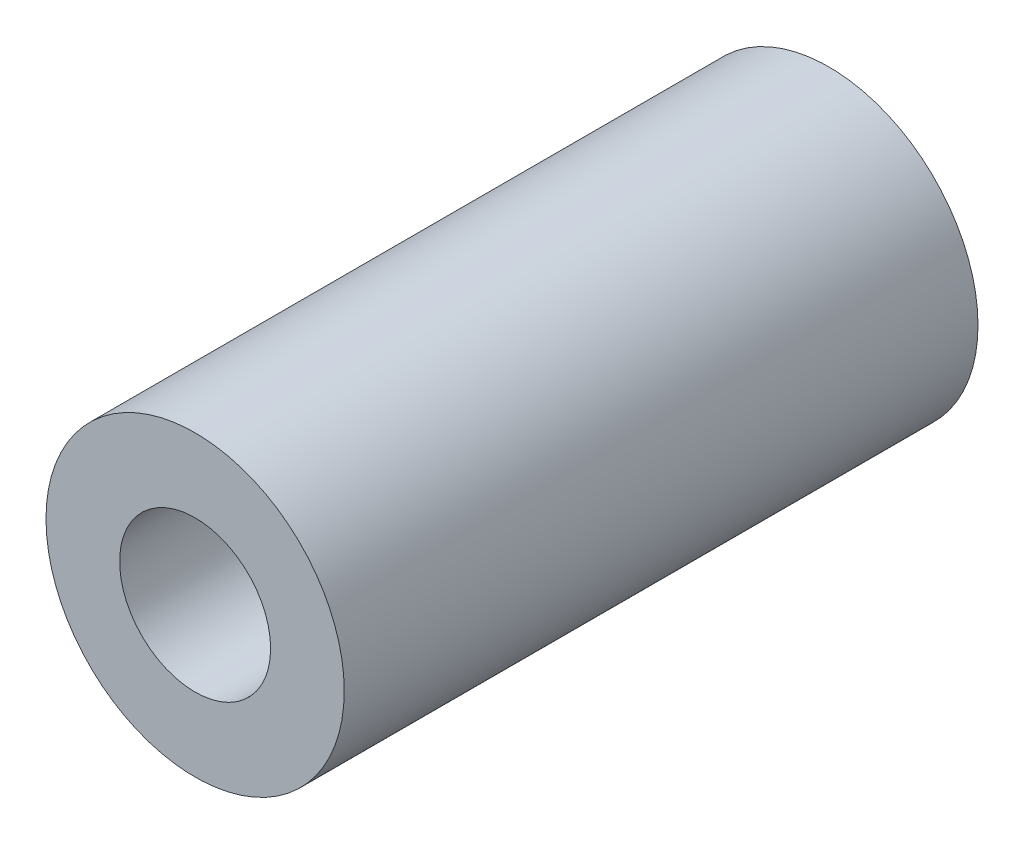
ISO-10303-21;
HEADER;
FILE_DESCRIPTION(('STEP AP214'),'2;1');
FILE_NAME('part.step','',(''),(''),'','','');
FILE_SCHEMA(('AUTOMOTIVE_DESIGN { 1 0 10303 214 1 1 1 1 }'));
ENDSEC;
DATA;
#1=APPLICATION_CONTEXT('core data for automotive mechanical design processes');
#2=APPLICATION_PROTOCOL_DEFINITION('international standard','automotive_design',2000,#1);
#3=PRODUCT_CONTEXT('',#1,'mechanical');
#4=PRODUCT('Part','Part','',(#3));
#5=PRODUCT_RELATED_PRODUCT_CATEGORY('part','',(#4));
#6=PRODUCT_DEFINITION_FORMATION('','',#4);
#7=PRODUCT_DEFINITION_CONTEXT('part definition',#1,'design');
#8=PRODUCT_DEFINITION('design','',#6,#7);
#9=PRODUCT_DEFINITION_SHAPE('','',#8);
#10=(LENGTH_UNIT() NAMED_UNIT(*) SI_UNIT(.MILLI.,.METRE.));
#11=(NAMED_UNIT(*) PLANE_ANGLE_UNIT() SI_UNIT($,.RADIAN.));
#12=(NAMED_UNIT(*) SI_UNIT($,.STERADIAN.) SOLID_ANGLE_UNIT());
#13=UNCERTAINTY_MEASURE_WITH_UNIT(LENGTH_MEASURE(1.E-05),#10,'distance_accuracy_value','');
#14=(GEOMETRIC_REPRESENTATION_CONTEXT(3) GLOBAL_UNCERTAINTY_ASSIGNED_CONTEXT((#13)) GLOBAL_UNIT_ASSIGNED_CONTEXT((#10,
#11,#12)) REPRESENTATION_CONTEXT('',''));
#15=CARTESIAN_POINT('',(0.,0.,0.));
#16=DIRECTION('',(0.,0.,1.));
#17=DIRECTION('',(1.,0.,0.));
#18=AXIS2_PLACEMENT_3D('',#15,#16,#17);
#19=CARTESIAN_POINT('',(0.,0.,34.));
#20=DIRECTION('',(0.,0.,-1.));
#21=DIRECTION('',(-1.,0.,0.));
#22=AXIS2_PLACEMENT_3D('',#19,#20,#21);
#23=CYLINDRICAL_SURFACE('',#22,8.);
#24=CARTESIAN_POINT('',(0.,0.,34.));
#25=DIRECTION('',(0.,0.,1.));
#26=DIRECTION('',(1.,0.,0.));
#27=AXIS2_PLACEMENT_3D('',#24,#25,#26);
#28=CIRCLE('',#27,8.);
#29=CARTESIAN_POINT('',(8.,0.,34.));
#30=VERTEX_POINT('',#29);
#31=EDGE_CURVE('E10',#30,#30,#28,.T.);
#32=ORIENTED_EDGE('',*,*,#31,.F.);
#33=EDGE_LOOP('',(#32));
#34=FACE_BOUND('',#33,.T.);
#35=CARTESIAN_POINT('',(0.,0.,0.));
#36=DIRECTION('',(0.,0.,1.));
#37=DIRECTION('',(1.,0.,0.));
#38=AXIS2_PLACEMENT_3D('',#35,#36,#37);
#39=CIRCLE('',#38,8.);
#40=CARTESIAN_POINT('',(8.,0.,0.));
#41=VERTEX_POINT('',#40);
#42=EDGE_CURVE('E42',#41,#41,#39,.T.);
#43=ORIENTED_EDGE('',*,*,#42,.T.);
#44=EDGE_LOOP('',(#43));
#45=FACE_BOUND('',#44,.T.);
#46=ADVANCED_FACE('F40',(#34,#45),#23,.T.);
#47=CARTESIAN_POINT('',(0.,0.,34.));
#48=DIRECTION('',(0.,0.,1.));
#49=DIRECTION('',(1.,0.,0.));
#50=AXIS2_PLACEMENT_3D('',#47,#48,#49);
#51=PLANE('',#50);
#52=CARTESIAN_POINT('',(0.,0.,34.));
#53=DIRECTION('',(0.,0.,1.));
#54=DIRECTION('',(1.,0.,0.));
#55=AXIS2_PLACEMENT_3D('',#52,#53,#54);
#56=CIRCLE('',#55,4.05);
#57=CARTESIAN_POINT('',(4.05,0.,34.));
#58=VERTEX_POINT('',#57);
#59=EDGE_CURVE('E37',#58,#58,#56,.F.);
#60=ORIENTED_EDGE('',*,*,#59,.T.);
#61=EDGE_LOOP('',(#60));
#62=FACE_BOUND('',#61,.T.);
#63=ORIENTED_EDGE('',*,*,#31,.T.);
#64=EDGE_LOOP('',(#63));
#65=FACE_BOUND('',#64,.T.);
#66=ADVANCED_FACE('F81',(#62,#65),#51,.T.);
#67=CARTESIAN_POINT('',(0.,0.,0.));
#68=DIRECTION('',(0.,0.,1.));
#69=DIRECTION('',(1.,0.,0.));
#70=AXIS2_PLACEMENT_3D('',#67,#68,#69);
#71=PLANE('',#70);
#72=CARTESIAN_POINT('',(0.,0.,0.));
#73=DIRECTION('',(0.,0.,1.));
#74=DIRECTION('',(1.,0.,0.));
#75=AXIS2_PLACEMENT_3D('',#72,#73,#74);
#76=CIRCLE('',#75,4.05);
#77=CARTESIAN_POINT('',(4.05,0.,0.));
#78=VERTEX_POINT('',#77);
#79=EDGE_CURVE('E47',#78,#78,#76,.F.);
#80=ORIENTED_EDGE('',*,*,#79,.F.);
#81=EDGE_LOOP('',(#80));
#82=FACE_BOUND('',#81,.T.);
#83=ORIENTED_EDGE('',*,*,#42,.F.);
#84=EDGE_LOOP('',(#83));
#85=FACE_BOUND('',#84,.T.);
#86=ADVANCED_FACE('F86',(#82,#85),#71,.F.);
#87=CARTESIAN_POINT('',(0.,0.,14.25));
#88=DIRECTION('',(0.,0.,-1.));
#89=DIRECTION('',(-1.,0.,0.));
#90=AXIS2_PLACEMENT_3D('',#87,#88,#89);
#91=CYLINDRICAL_SURFACE('',#90,4.05);
#92=CARTESIAN_POINT('',(0.,0.,14.25));
#93=DIRECTION('',(0.,0.,1.));
#94=DIRECTION('',(1.,0.,0.));
#95=AXIS2_PLACEMENT_3D('',#92,#93,#94);
#96=CIRCLE('',#95,4.05);
#97=CARTESIAN_POINT('',(4.05,0.,14.25));
#98=VERTEX_POINT('',#97);
#99=EDGE_CURVE('E55',#98,#98,#96,.T.);
#100=ORIENTED_EDGE('',*,*,#99,.T.);
#101=EDGE_LOOP('',(#100));
#102=FACE_BOUND('',#101,.T.);
#103=ORIENTED_EDGE('',*,*,#79,.T.);
#104=EDGE_LOOP('',(#103));
#105=FACE_BOUND('',#104,.T.);
#106=ADVANCED_FACE('F78',(#102,#105),#91,.F.);
#107=CARTESIAN_POINT('',(0.,0.,14.25));
#108=DIRECTION('',(0.,0.,1.));
#109=DIRECTION('',(1.,0.,0.));
#110=AXIS2_PLACEMENT_3D('',#107,#108,#109);
#111=PLANE('',#110);
#112=ORIENTED_EDGE('',*,*,#99,.F.);
#113=EDGE_LOOP('',(#112));
#114=FACE_BOUND('',#113,.T.);
#115=ADVANCED_FACE('F72',(#114),#111,.F.);
#116=CARTESIAN_POINT('',(0.,0.,34.1));
#117=DIRECTION('',(0.,0.,-1.));
#118=DIRECTION('',(-1.,0.,0.));
#119=AXIS2_PLACEMENT_3D('',#116,#117,#118);
#120=CYLINDRICAL_SURFACE('',#119,4.05);
#121=ORIENTED_EDGE('',*,*,#59,.F.);
#122=EDGE_LOOP('',(#121));
#123=FACE_BOUND('',#122,.T.);
#124=CARTESIAN_POINT('',(0.,0.,19.75));
#125=DIRECTION('',(0.,0.,1.));
#126=DIRECTION('',(1.,0.,0.));
#127=AXIS2_PLACEMENT_3D('',#124,#125,#126);
#128=CIRCLE('',#127,4.05);
#129=CARTESIAN_POINT('',(4.05,0.,19.75));
#130=VERTEX_POINT('',#129);
#131=EDGE_CURVE('E62',#130,#130,#128,.T.);
#132=ORIENTED_EDGE('',*,*,#131,.F.);
#133=EDGE_LOOP('',(#132));
#134=FACE_BOUND('',#133,.T.);
#135=ADVANCED_FACE('F66',(#123,#134),#120,.F.);
#136=CARTESIAN_POINT('',(0.,0.,19.75));
#137=DIRECTION('',(0.,0.,1.));
#138=DIRECTION('',(1.,0.,0.));
#139=AXIS2_PLACEMENT_3D('',#136,#137,#138);
#140=PLANE('',#139);
#141=ORIENTED_EDGE('',*,*,#131,.T.);
#142=EDGE_LOOP('',(#141));
#143=FACE_BOUND('',#142,.T.);
#144=ADVANCED_FACE('F70',(#143),#140,.T.);
#145=CLOSED_SHELL('',(#46,#66,#86,#106,#115,#135,#144));
#146=MANIFOLD_SOLID_BREP('B2',#145);
#147=ADVANCED_BREP_SHAPE_REPRESENTATION('',(#18,#146),#14);
#148=SHAPE_DEFINITION_REPRESENTATION(#9,#147);
ENDSEC;
END-ISO-10303-21;
